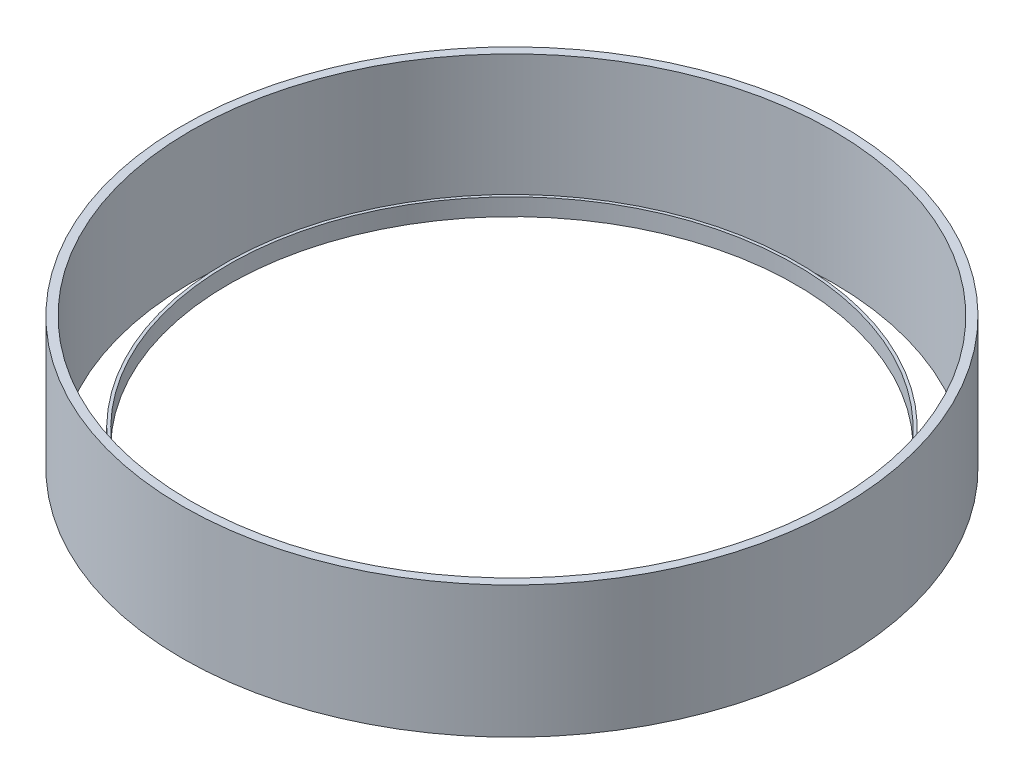
ISO-10303-21;
HEADER;
FILE_DESCRIPTION(('STEP AP214'),'2;1');
FILE_NAME('part.step','',(''),(''),'','','');
FILE_SCHEMA(('AUTOMOTIVE_DESIGN { 1 0 10303 214 1 1 1 1 }'));
ENDSEC;
DATA;
#1=APPLICATION_CONTEXT('core data for automotive mechanical design processes');
#2=APPLICATION_PROTOCOL_DEFINITION('international standard','automotive_design',2000,#1);
#3=PRODUCT_CONTEXT('',#1,'mechanical');
#4=PRODUCT('Part','Part','',(#3));
#5=PRODUCT_RELATED_PRODUCT_CATEGORY('part','',(#4));
#6=PRODUCT_DEFINITION_FORMATION('','',#4);
#7=PRODUCT_DEFINITION_CONTEXT('part definition',#1,'design');
#8=PRODUCT_DEFINITION('design','',#6,#7);
#9=PRODUCT_DEFINITION_SHAPE('','',#8);
#10=(LENGTH_UNIT() NAMED_UNIT(*) SI_UNIT(.MILLI.,.METRE.));
#11=(NAMED_UNIT(*) PLANE_ANGLE_UNIT() SI_UNIT($,.RADIAN.));
#12=(NAMED_UNIT(*) SI_UNIT($,.STERADIAN.) SOLID_ANGLE_UNIT());
#13=UNCERTAINTY_MEASURE_WITH_UNIT(LENGTH_MEASURE(1.E-05),#10,'distance_accuracy_value','');
#14=(GEOMETRIC_REPRESENTATION_CONTEXT(3) GLOBAL_UNCERTAINTY_ASSIGNED_CONTEXT((#13)) GLOBAL_UNIT_ASSIGNED_CONTEXT((#10,
#11,#12)) REPRESENTATION_CONTEXT('',''));
#15=CARTESIAN_POINT('',(0.,0.,0.));
#16=DIRECTION('',(0.,0.,1.));
#17=DIRECTION('',(1.,0.,0.));
#18=AXIS2_PLACEMENT_3D('',#15,#16,#17);
#19=CARTESIAN_POINT('',(0.,-3.,0.));
#20=DIRECTION('',(0.,1.,0.));
#21=DIRECTION('',(0.,0.,1.));
#22=AXIS2_PLACEMENT_3D('',#19,#20,#21);
#23=CYLINDRICAL_SURFACE('',#22,57.5);
#24=CARTESIAN_POINT('',(0.,-3.,0.));
#25=DIRECTION('',(0.,1.,0.));
#26=DIRECTION('',(0.,0.,1.));
#27=AXIS2_PLACEMENT_3D('',#24,#25,#26);
#28=CIRCLE('',#27,57.5);
#29=CARTESIAN_POINT('',(0.,-3.,57.5));
#30=VERTEX_POINT('',#29);
#31=EDGE_CURVE('E11',#30,#30,#28,.T.);
#32=ORIENTED_EDGE('',*,*,#31,.T.);
#33=EDGE_LOOP('',(#32));
#34=FACE_BOUND('',#33,.T.);
#35=CARTESIAN_POINT('',(0.,20.,0.));
#36=DIRECTION('',(0.,1.,0.));
#37=DIRECTION('',(0.,0.,1.));
#38=AXIS2_PLACEMENT_3D('',#35,#36,#37);
#39=CIRCLE('',#38,57.5);
#40=CARTESIAN_POINT('',(0.,20.,57.5));
#41=VERTEX_POINT('',#40);
#42=EDGE_CURVE('E49',#41,#41,#39,.T.);
#43=ORIENTED_EDGE('',*,*,#42,.F.);
#44=EDGE_LOOP('',(#43));
#45=FACE_BOUND('',#44,.T.);
#46=ADVANCED_FACE('F39',(#34,#45),#23,.T.);
#47=CARTESIAN_POINT('',(0.,-3.,0.));
#48=DIRECTION('',(0.,1.,0.));
#49=DIRECTION('',(0.,0.,1.));
#50=AXIS2_PLACEMENT_3D('',#47,#48,#49);
#51=PLANE('',#50);
#52=CARTESIAN_POINT('',(0.,-3.,0.));
#53=DIRECTION('',(0.,1.,0.));
#54=DIRECTION('',(0.,0.,1.));
#55=AXIS2_PLACEMENT_3D('',#52,#53,#54);
#56=CIRCLE('',#55,56.);
#57=CARTESIAN_POINT('',(0.,-3.,56.));
#58=VERTEX_POINT('',#57);
#59=EDGE_CURVE('E45',#58,#58,#56,.T.);
#60=ORIENTED_EDGE('',*,*,#59,.T.);
#61=EDGE_LOOP('',(#60));
#62=FACE_BOUND('',#61,.T.);
#63=ORIENTED_EDGE('',*,*,#31,.F.);
#64=EDGE_LOOP('',(#63));
#65=FACE_BOUND('',#64,.T.);
#66=ADVANCED_FACE('F68',(#62,#65),#51,.F.);
#67=CARTESIAN_POINT('',(0.,-3.,0.));
#68=DIRECTION('',(0.,1.,0.));
#69=DIRECTION('',(0.,0.,1.));
#70=AXIS2_PLACEMENT_3D('',#67,#68,#69);
#71=CYLINDRICAL_SURFACE('',#70,56.);
#72=ORIENTED_EDGE('',*,*,#59,.F.);
#73=EDGE_LOOP('',(#72));
#74=FACE_BOUND('',#73,.T.);
#75=CARTESIAN_POINT('',(0.,20.,0.));
#76=DIRECTION('',(0.,1.,0.));
#77=DIRECTION('',(0.,0.,1.));
#78=AXIS2_PLACEMENT_3D('',#75,#76,#77);
#79=CIRCLE('',#78,56.);
#80=CARTESIAN_POINT('',(0.,20.,56.));
#81=VERTEX_POINT('',#80);
#82=EDGE_CURVE('E53',#81,#81,#79,.T.);
#83=ORIENTED_EDGE('',*,*,#82,.T.);
#84=EDGE_LOOP('',(#83));
#85=FACE_BOUND('',#84,.T.);
#86=ADVANCED_FACE('F59',(#74,#85),#71,.F.);
#87=CARTESIAN_POINT('',(0.,20.,0.));
#88=DIRECTION('',(0.,1.,0.));
#89=DIRECTION('',(0.,0.,1.));
#90=AXIS2_PLACEMENT_3D('',#87,#88,#89);
#91=PLANE('',#90);
#92=ORIENTED_EDGE('',*,*,#42,.T.);
#93=EDGE_LOOP('',(#92));
#94=FACE_BOUND('',#93,.T.);
#95=ORIENTED_EDGE('',*,*,#82,.F.);
#96=EDGE_LOOP('',(#95));
#97=FACE_BOUND('',#96,.T.);
#98=ADVANCED_FACE('F61',(#94,#97),#91,.T.);
#99=CLOSED_SHELL('',(#46,#66,#86,#98));
#100=MANIFOLD_SOLID_BREP('B2',#99);
#101=CARTESIAN_POINT('',(0.,3.,0.));
#102=DIRECTION('',(0.,1.,0.));
#103=DIRECTION('',(0.,0.,1.));
#104=AXIS2_PLACEMENT_3D('',#101,#102,#103);
#105=PLANE('',#104);
#106=CARTESIAN_POINT('',(0.,3.,0.));
#107=DIRECTION('',(0.,1.,0.));
#108=DIRECTION('',(0.,0.,1.));
#109=AXIS2_PLACEMENT_3D('',#106,#107,#108);
#110=CIRCLE('',#109,50.);
#111=CARTESIAN_POINT('',(0.,3.,50.));
#112=VERTEX_POINT('',#111);
#113=EDGE_CURVE('E38',#112,#112,#110,.T.);
#114=ORIENTED_EDGE('',*,*,#113,.T.);
#115=EDGE_LOOP('',(#114));
#116=FACE_BOUND('',#115,.T.);
#117=CARTESIAN_POINT('',(0.,3.,0.));
#118=DIRECTION('',(0.,1.,0.));
#119=DIRECTION('',(0.,0.,1.));
#120=AXIS2_PLACEMENT_3D('',#117,#118,#119);
#121=CIRCLE('',#120,49.5);
#122=CARTESIAN_POINT('',(0.,3.,49.5));
#123=VERTEX_POINT('',#122);
#124=EDGE_CURVE('E112',#123,#123,#121,.T.);
#125=ORIENTED_EDGE('',*,*,#124,.F.);
#126=EDGE_LOOP('',(#125));
#127=FACE_BOUND('',#126,.T.);
#128=ADVANCED_FACE('F101',(#116,#127),#105,.T.);
#129=CARTESIAN_POINT('',(0.,0.,0.));
#130=DIRECTION('',(0.,1.,0.));
#131=DIRECTION('',(0.,0.,1.));
#132=AXIS2_PLACEMENT_3D('',#129,#130,#131);
#133=PLANE('',#132);
#134=CARTESIAN_POINT('',(0.,0.,0.));
#135=DIRECTION('',(0.,1.,0.));
#136=DIRECTION('',(0.,0.,1.));
#137=AXIS2_PLACEMENT_3D('',#134,#135,#136);
#138=CIRCLE('',#137,50.);
#139=CARTESIAN_POINT('',(0.,0.,50.));
#140=VERTEX_POINT('',#139);
#141=EDGE_CURVE('E105',#140,#140,#138,.T.);
#142=ORIENTED_EDGE('',*,*,#141,.F.);
#143=EDGE_LOOP('',(#142));
#144=FACE_BOUND('',#143,.T.);
#145=CARTESIAN_POINT('',(0.,0.,0.));
#146=DIRECTION('',(0.,1.,0.));
#147=DIRECTION('',(0.,0.,1.));
#148=AXIS2_PLACEMENT_3D('',#145,#146,#147);
#149=CIRCLE('',#148,49.5);
#150=CARTESIAN_POINT('',(0.,0.,49.5));
#151=VERTEX_POINT('',#150);
#152=EDGE_CURVE('E114',#151,#151,#149,.T.);
#153=ORIENTED_EDGE('',*,*,#152,.T.);
#154=EDGE_LOOP('',(#153));
#155=FACE_BOUND('',#154,.T.);
#156=ADVANCED_FACE('F124',(#144,#155),#133,.F.);
#157=CARTESIAN_POINT('',(0.,3.,0.));
#158=DIRECTION('',(0.,-1.,0.));
#159=DIRECTION('',(0.,0.,-1.));
#160=AXIS2_PLACEMENT_3D('',#157,#158,#159);
#161=CYLINDRICAL_SURFACE('',#160,50.);
#162=ORIENTED_EDGE('',*,*,#113,.F.);
#163=EDGE_LOOP('',(#162));
#164=FACE_BOUND('',#163,.T.);
#165=ORIENTED_EDGE('',*,*,#141,.T.);
#166=EDGE_LOOP('',(#165));
#167=FACE_BOUND('',#166,.T.);
#168=ADVANCED_FACE('F103',(#164,#167),#161,.T.);
#169=CARTESIAN_POINT('',(0.,3.,0.));
#170=DIRECTION('',(0.,-1.,0.));
#171=DIRECTION('',(0.,0.,-1.));
#172=AXIS2_PLACEMENT_3D('',#169,#170,#171);
#173=CYLINDRICAL_SURFACE('',#172,49.5);
#174=ORIENTED_EDGE('',*,*,#124,.T.);
#175=EDGE_LOOP('',(#174));
#176=FACE_BOUND('',#175,.T.);
#177=ORIENTED_EDGE('',*,*,#152,.F.);
#178=EDGE_LOOP('',(#177));
#179=FACE_BOUND('',#178,.T.);
#180=ADVANCED_FACE('F120',(#176,#179),#173,.F.);
#181=CLOSED_SHELL('',(#128,#156,#168,#180));
#182=MANIFOLD_SOLID_BREP('B6',#181);
#183=ADVANCED_BREP_SHAPE_REPRESENTATION('',(#18,#100,#182),#14);
#184=SHAPE_DEFINITION_REPRESENTATION(#9,#183);
ENDSEC;
END-ISO-10303-21;
